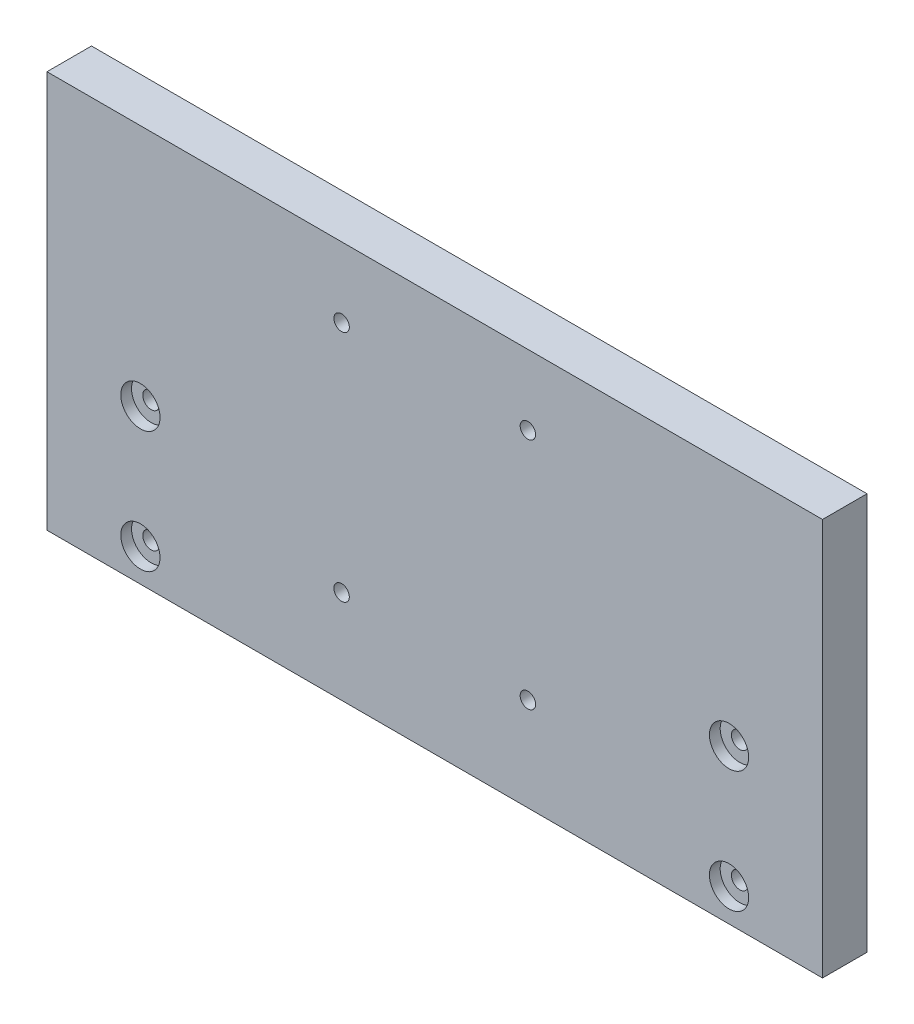
ISO-10303-21;
HEADER;
FILE_DESCRIPTION(('STEP AP214'),'2;1');
FILE_NAME('part.step','',(''),(''),'','','');
FILE_SCHEMA(('AUTOMOTIVE_DESIGN { 1 0 10303 214 1 1 1 1 }'));
ENDSEC;
DATA;
#1=APPLICATION_CONTEXT('core data for automotive mechanical design processes');
#2=APPLICATION_PROTOCOL_DEFINITION('international standard','automotive_design',2000,#1);
#3=PRODUCT_CONTEXT('',#1,'mechanical');
#4=PRODUCT('Part','Part','',(#3));
#5=PRODUCT_RELATED_PRODUCT_CATEGORY('part','',(#4));
#6=PRODUCT_DEFINITION_FORMATION('','',#4);
#7=PRODUCT_DEFINITION_CONTEXT('part definition',#1,'design');
#8=PRODUCT_DEFINITION('design','',#6,#7);
#9=PRODUCT_DEFINITION_SHAPE('','',#8);
#10=(LENGTH_UNIT() NAMED_UNIT(*) SI_UNIT(.MILLI.,.METRE.));
#11=(NAMED_UNIT(*) PLANE_ANGLE_UNIT() SI_UNIT($,.RADIAN.));
#12=(NAMED_UNIT(*) SI_UNIT($,.STERADIAN.) SOLID_ANGLE_UNIT());
#13=UNCERTAINTY_MEASURE_WITH_UNIT(LENGTH_MEASURE(1.E-05),#10,'distance_accuracy_value','');
#14=(GEOMETRIC_REPRESENTATION_CONTEXT(3) GLOBAL_UNCERTAINTY_ASSIGNED_CONTEXT((#13)) GLOBAL_UNIT_ASSIGNED_CONTEXT((#10,
#11,#12)) REPRESENTATION_CONTEXT('',''));
#15=CARTESIAN_POINT('',(0.,0.,0.));
#16=DIRECTION('',(0.,0.,1.));
#17=DIRECTION('',(1.,0.,0.));
#18=AXIS2_PLACEMENT_3D('',#15,#16,#17);
#19=CARTESIAN_POINT('',(83.,0.,9.53));
#20=DIRECTION('',(0.,1.,0.));
#21=DIRECTION('',(-1.,0.,0.));
#22=AXIS2_PLACEMENT_3D('',#19,#20,#21);
#23=PLANE('',#22);
#24=DIRECTION('',(1.,0.,0.));
#25=VECTOR('',#24,1.);
#26=CARTESIAN_POINT('',(83.,0.,0.));
#27=LINE('',#26,#25);
#28=CARTESIAN_POINT('',(0.,0.,0.));
#29=VERTEX_POINT('',#28);
#30=CARTESIAN_POINT('',(166.,0.,0.));
#31=VERTEX_POINT('',#30);
#32=EDGE_CURVE('E105',#29,#31,#27,.T.);
#33=ORIENTED_EDGE('',*,*,#32,.T.);
#34=DIRECTION('',(0.,0.,-1.));
#35=VECTOR('',#34,1.);
#36=CARTESIAN_POINT('',(166.,0.,9.53));
#37=LINE('',#36,#35);
#38=CARTESIAN_POINT('',(166.,0.,9.53));
#39=VERTEX_POINT('',#38);
#40=EDGE_CURVE('E11',#39,#31,#37,.T.);
#41=ORIENTED_EDGE('',*,*,#40,.F.);
#42=DIRECTION('',(1.,0.,0.));
#43=VECTOR('',#42,1.);
#44=CARTESIAN_POINT('',(83.,0.,9.53));
#45=LINE('',#44,#43);
#46=CARTESIAN_POINT('',(0.,0.,9.53));
#47=VERTEX_POINT('',#46);
#48=EDGE_CURVE('E90',#47,#39,#45,.T.);
#49=ORIENTED_EDGE('',*,*,#48,.F.);
#50=DIRECTION('',(0.,0.,-1.));
#51=VECTOR('',#50,1.);
#52=CARTESIAN_POINT('',(0.,0.,9.53));
#53=LINE('',#52,#51);
#54=EDGE_CURVE('E57',#47,#29,#53,.T.);
#55=ORIENTED_EDGE('',*,*,#54,.T.);
#56=EDGE_LOOP('',(#33,#41,#49,#55));
#57=FACE_BOUND('',#56,.T.);
#58=ADVANCED_FACE('F39',(#57),#23,.F.);
#59=CARTESIAN_POINT('',(166.,-102.701770866364,9.53));
#60=DIRECTION('',(-1.,0.,0.));
#61=DIRECTION('',(0.,0.,1.));
#62=AXIS2_PLACEMENT_3D('',#59,#60,#61);
#63=PLANE('',#62);
#64=DIRECTION('',(0.,1.,0.));
#65=VECTOR('',#64,1.);
#66=CARTESIAN_POINT('',(166.,-102.701770866364,0.));
#67=LINE('',#66,#65);
#68=CARTESIAN_POINT('',(166.,85.,0.));
#69=VERTEX_POINT('',#68);
#70=EDGE_CURVE('E95',#31,#69,#67,.T.);
#71=ORIENTED_EDGE('',*,*,#70,.T.);
#72=DIRECTION('',(0.,0.,-1.));
#73=VECTOR('',#72,1.);
#74=CARTESIAN_POINT('',(166.,85.,9.53));
#75=LINE('',#74,#73);
#76=CARTESIAN_POINT('',(166.,85.,9.53));
#77=VERTEX_POINT('',#76);
#78=EDGE_CURVE('E48',#77,#69,#75,.T.);
#79=ORIENTED_EDGE('',*,*,#78,.F.);
#80=DIRECTION('',(0.,1.,0.));
#81=VECTOR('',#80,1.);
#82=CARTESIAN_POINT('',(166.,-102.701770866364,9.53));
#83=LINE('',#82,#81);
#84=EDGE_CURVE('E82',#39,#77,#83,.T.);
#85=ORIENTED_EDGE('',*,*,#84,.F.);
#86=ORIENTED_EDGE('',*,*,#40,.T.);
#87=EDGE_LOOP('',(#71,#79,#85,#86));
#88=FACE_BOUND('',#87,.T.);
#89=ADVANCED_FACE('F94',(#88),#63,.F.);
#90=CARTESIAN_POINT('',(83.,85.,9.53));
#91=DIRECTION('',(0.,1.,0.));
#92=DIRECTION('',(-1.,0.,0.));
#93=AXIS2_PLACEMENT_3D('',#90,#91,#92);
#94=PLANE('',#93);
#95=DIRECTION('',(1.,0.,0.));
#96=VECTOR('',#95,1.);
#97=CARTESIAN_POINT('',(83.,85.,0.));
#98=LINE('',#97,#96);
#99=CARTESIAN_POINT('',(0.,85.,0.));
#100=VERTEX_POINT('',#99);
#101=EDGE_CURVE('E109',#100,#69,#98,.T.);
#102=ORIENTED_EDGE('',*,*,#101,.F.);
#103=DIRECTION('',(0.,0.,-1.));
#104=VECTOR('',#103,1.);
#105=CARTESIAN_POINT('',(0.,85.,9.53));
#106=LINE('',#105,#104);
#107=CARTESIAN_POINT('',(0.,85.,9.53));
#108=VERTEX_POINT('',#107);
#109=EDGE_CURVE('E71',#108,#100,#106,.T.);
#110=ORIENTED_EDGE('',*,*,#109,.F.);
#111=DIRECTION('',(1.,0.,0.));
#112=VECTOR('',#111,1.);
#113=CARTESIAN_POINT('',(83.,85.,9.53));
#114=LINE('',#113,#112);
#115=EDGE_CURVE('E89',#108,#77,#114,.T.);
#116=ORIENTED_EDGE('',*,*,#115,.T.);
#117=ORIENTED_EDGE('',*,*,#78,.T.);
#118=EDGE_LOOP('',(#102,#110,#116,#117));
#119=FACE_BOUND('',#118,.T.);
#120=ADVANCED_FACE('F99',(#119),#94,.T.);
#121=CARTESIAN_POINT('',(0.,-102.701770866364,9.53));
#122=DIRECTION('',(-1.,0.,0.));
#123=DIRECTION('',(0.,-1.,0.));
#124=AXIS2_PLACEMENT_3D('',#121,#122,#123);
#125=PLANE('',#124);
#126=DIRECTION('',(0.,1.,0.));
#127=VECTOR('',#126,1.);
#128=CARTESIAN_POINT('',(0.,-102.701770866364,0.));
#129=LINE('',#128,#127);
#130=EDGE_CURVE('E111',#29,#100,#129,.T.);
#131=ORIENTED_EDGE('',*,*,#130,.F.);
#132=ORIENTED_EDGE('',*,*,#54,.F.);
#133=DIRECTION('',(0.,1.,0.));
#134=VECTOR('',#133,1.);
#135=CARTESIAN_POINT('',(0.,-102.701770866364,9.53));
#136=LINE('',#135,#134);
#137=EDGE_CURVE('E100',#47,#108,#136,.T.);
#138=ORIENTED_EDGE('',*,*,#137,.T.);
#139=ORIENTED_EDGE('',*,*,#109,.T.);
#140=EDGE_LOOP('',(#131,#132,#138,#139));
#141=FACE_BOUND('',#140,.T.);
#142=ADVANCED_FACE('F211',(#141),#125,.T.);
#143=CARTESIAN_POINT('',(83.,-102.701770866364,9.53));
#144=DIRECTION('',(0.,0.,1.));
#145=DIRECTION('',(1.,0.,0.));
#146=AXIS2_PLACEMENT_3D('',#143,#144,#145);
#147=PLANE('',#146);
#148=CARTESIAN_POINT('',(63.065,70.,9.53));
#149=DIRECTION('',(0.,0.,1.));
#150=DIRECTION('',(1.,0.,0.));
#151=AXIS2_PLACEMENT_3D('',#148,#149,#150);
#152=CIRCLE('',#151,1.64999999999998);
#153=CARTESIAN_POINT('',(64.715,70.,9.53));
#154=VERTEX_POINT('',#153);
#155=EDGE_CURVE('E136',#154,#154,#152,.T.);
#156=ORIENTED_EDGE('',*,*,#155,.F.);
#157=EDGE_LOOP('',(#156));
#158=FACE_BOUND('',#157,.T.);
#159=CARTESIAN_POINT('',(63.065,20.,9.53));
#160=DIRECTION('',(0.,0.,1.));
#161=DIRECTION('',(1.,0.,0.));
#162=AXIS2_PLACEMENT_3D('',#159,#160,#161);
#163=CIRCLE('',#162,1.64999999999998);
#164=CARTESIAN_POINT('',(64.715,20.,9.53));
#165=VERTEX_POINT('',#164);
#166=EDGE_CURVE('E126',#165,#165,#163,.T.);
#167=ORIENTED_EDGE('',*,*,#166,.F.);
#168=EDGE_LOOP('',(#167));
#169=FACE_BOUND('',#168,.T.);
#170=CARTESIAN_POINT('',(102.935,70.,9.53));
#171=DIRECTION('',(0.,0.,1.));
#172=DIRECTION('',(1.,0.,0.));
#173=AXIS2_PLACEMENT_3D('',#170,#171,#172);
#174=CIRCLE('',#173,1.64999999999998);
#175=CARTESIAN_POINT('',(104.585,70.,9.53));
#176=VERTEX_POINT('',#175);
#177=EDGE_CURVE('E123',#176,#176,#174,.T.);
#178=ORIENTED_EDGE('',*,*,#177,.F.);
#179=EDGE_LOOP('',(#178));
#180=FACE_BOUND('',#179,.T.);
#181=CARTESIAN_POINT('',(102.935,20.,9.53));
#182=DIRECTION('',(0.,0.,1.));
#183=DIRECTION('',(1.,0.,0.));
#184=AXIS2_PLACEMENT_3D('',#181,#182,#183);
#185=CIRCLE('',#184,1.64999999999998);
#186=CARTESIAN_POINT('',(104.585,20.,9.53));
#187=VERTEX_POINT('',#186);
#188=EDGE_CURVE('E120',#187,#187,#185,.T.);
#189=ORIENTED_EDGE('',*,*,#188,.F.);
#190=EDGE_LOOP('',(#189));
#191=FACE_BOUND('',#190,.T.);
#192=CARTESIAN_POINT('',(20.,33.,9.53));
#193=DIRECTION('',(0.,0.,1.));
#194=DIRECTION('',(1.,0.,0.));
#195=AXIS2_PLACEMENT_3D('',#192,#193,#194);
#196=CIRCLE('',#195,4.2);
#197=CARTESIAN_POINT('',(24.2,33.,9.53));
#198=VERTEX_POINT('',#197);
#199=EDGE_CURVE('E119',#198,#198,#196,.T.);
#200=ORIENTED_EDGE('',*,*,#199,.F.);
#201=EDGE_LOOP('',(#200));
#202=FACE_BOUND('',#201,.T.);
#203=CARTESIAN_POINT('',(20.,7.00000000000001,9.53));
#204=DIRECTION('',(0.,0.,1.));
#205=DIRECTION('',(1.,0.,0.));
#206=AXIS2_PLACEMENT_3D('',#203,#204,#205);
#207=CIRCLE('',#206,4.2);
#208=CARTESIAN_POINT('',(24.2,7.00000000000001,9.53));
#209=VERTEX_POINT('',#208);
#210=EDGE_CURVE('E152',#209,#209,#207,.T.);
#211=ORIENTED_EDGE('',*,*,#210,.F.);
#212=EDGE_LOOP('',(#211));
#213=FACE_BOUND('',#212,.T.);
#214=CARTESIAN_POINT('',(146.,33.,9.53));
#215=DIRECTION('',(0.,0.,1.));
#216=DIRECTION('',(1.,0.,0.));
#217=AXIS2_PLACEMENT_3D('',#214,#215,#216);
#218=CIRCLE('',#217,4.20000000000001);
#219=CARTESIAN_POINT('',(150.2,33.,9.53));
#220=VERTEX_POINT('',#219);
#221=EDGE_CURVE('E164',#220,#220,#218,.T.);
#222=ORIENTED_EDGE('',*,*,#221,.F.);
#223=EDGE_LOOP('',(#222));
#224=FACE_BOUND('',#223,.T.);
#225=CARTESIAN_POINT('',(146.,7.00000000000001,9.53));
#226=DIRECTION('',(0.,0.,1.));
#227=DIRECTION('',(1.,0.,0.));
#228=AXIS2_PLACEMENT_3D('',#225,#226,#227);
#229=CIRCLE('',#228,4.20000000000001);
#230=CARTESIAN_POINT('',(150.2,7.00000000000001,9.53));
#231=VERTEX_POINT('',#230);
#232=EDGE_CURVE('E176',#231,#231,#229,.T.);
#233=ORIENTED_EDGE('',*,*,#232,.F.);
#234=EDGE_LOOP('',(#233));
#235=FACE_BOUND('',#234,.T.);
#236=ORIENTED_EDGE('',*,*,#48,.T.);
#237=ORIENTED_EDGE('',*,*,#84,.T.);
#238=ORIENTED_EDGE('',*,*,#115,.F.);
#239=ORIENTED_EDGE('',*,*,#137,.F.);
#240=EDGE_LOOP('',(#236,#237,#238,#239));
#241=FACE_BOUND('',#240,.T.);
#242=ADVANCED_FACE('F86',(#158,#169,#180,#191,#202,#213,#224,#235,#241),#147,.T.);
#243=CARTESIAN_POINT('',(83.,-102.701770866364,0.));
#244=DIRECTION('',(0.,0.,1.));
#245=DIRECTION('',(1.,0.,0.));
#246=AXIS2_PLACEMENT_3D('',#243,#244,#245);
#247=PLANE('',#246);
#248=CARTESIAN_POINT('',(63.065,70.,0.));
#249=DIRECTION('',(0.,0.,1.));
#250=DIRECTION('',(1.,0.,0.));
#251=AXIS2_PLACEMENT_3D('',#248,#249,#250);
#252=CIRCLE('',#251,1.64999999999998);
#253=CARTESIAN_POINT('',(64.715,70.,0.));
#254=VERTEX_POINT('',#253);
#255=EDGE_CURVE('E42',#254,#254,#252,.T.);
#256=ORIENTED_EDGE('',*,*,#255,.T.);
#257=EDGE_LOOP('',(#256));
#258=FACE_BOUND('',#257,.T.);
#259=CARTESIAN_POINT('',(63.065,20.,0.));
#260=DIRECTION('',(0.,0.,1.));
#261=DIRECTION('',(1.,0.,0.));
#262=AXIS2_PLACEMENT_3D('',#259,#260,#261);
#263=CIRCLE('',#262,1.64999999999998);
#264=CARTESIAN_POINT('',(64.715,20.,0.));
#265=VERTEX_POINT('',#264);
#266=EDGE_CURVE('E124',#265,#265,#263,.T.);
#267=ORIENTED_EDGE('',*,*,#266,.T.);
#268=EDGE_LOOP('',(#267));
#269=FACE_BOUND('',#268,.T.);
#270=CARTESIAN_POINT('',(102.935,70.,0.));
#271=DIRECTION('',(0.,0.,1.));
#272=DIRECTION('',(1.,0.,0.));
#273=AXIS2_PLACEMENT_3D('',#270,#271,#272);
#274=CIRCLE('',#273,1.64999999999998);
#275=CARTESIAN_POINT('',(104.585,70.,0.));
#276=VERTEX_POINT('',#275);
#277=EDGE_CURVE('E121',#276,#276,#274,.T.);
#278=ORIENTED_EDGE('',*,*,#277,.T.);
#279=EDGE_LOOP('',(#278));
#280=FACE_BOUND('',#279,.T.);
#281=CARTESIAN_POINT('',(102.935,20.,0.));
#282=DIRECTION('',(0.,0.,1.));
#283=DIRECTION('',(1.,0.,0.));
#284=AXIS2_PLACEMENT_3D('',#281,#282,#283);
#285=CIRCLE('',#284,1.64999999999998);
#286=CARTESIAN_POINT('',(104.585,20.,0.));
#287=VERTEX_POINT('',#286);
#288=EDGE_CURVE('E116',#287,#287,#285,.T.);
#289=ORIENTED_EDGE('',*,*,#288,.T.);
#290=EDGE_LOOP('',(#289));
#291=FACE_BOUND('',#290,.T.);
#292=CARTESIAN_POINT('',(20.,33.,0.));
#293=DIRECTION('',(0.,0.,1.));
#294=DIRECTION('',(1.,0.,0.));
#295=AXIS2_PLACEMENT_3D('',#292,#293,#294);
#296=CIRCLE('',#295,1.8);
#297=CARTESIAN_POINT('',(21.8,33.,0.));
#298=VERTEX_POINT('',#297);
#299=EDGE_CURVE('E149',#298,#298,#296,.T.);
#300=ORIENTED_EDGE('',*,*,#299,.T.);
#301=EDGE_LOOP('',(#300));
#302=FACE_BOUND('',#301,.T.);
#303=CARTESIAN_POINT('',(20.,7.00000000000001,0.));
#304=DIRECTION('',(0.,0.,1.));
#305=DIRECTION('',(1.,0.,0.));
#306=AXIS2_PLACEMENT_3D('',#303,#304,#305);
#307=CIRCLE('',#306,1.8);
#308=CARTESIAN_POINT('',(21.8,7.00000000000001,0.));
#309=VERTEX_POINT('',#308);
#310=EDGE_CURVE('E161',#309,#309,#307,.T.);
#311=ORIENTED_EDGE('',*,*,#310,.T.);
#312=EDGE_LOOP('',(#311));
#313=FACE_BOUND('',#312,.T.);
#314=CARTESIAN_POINT('',(146.,33.,0.));
#315=DIRECTION('',(0.,0.,1.));
#316=DIRECTION('',(1.,0.,0.));
#317=AXIS2_PLACEMENT_3D('',#314,#315,#316);
#318=CIRCLE('',#317,1.8);
#319=CARTESIAN_POINT('',(147.8,33.,0.));
#320=VERTEX_POINT('',#319);
#321=EDGE_CURVE('E173',#320,#320,#318,.T.);
#322=ORIENTED_EDGE('',*,*,#321,.T.);
#323=EDGE_LOOP('',(#322));
#324=FACE_BOUND('',#323,.T.);
#325=CARTESIAN_POINT('',(146.,7.00000000000001,0.));
#326=DIRECTION('',(0.,0.,1.));
#327=DIRECTION('',(1.,0.,0.));
#328=AXIS2_PLACEMENT_3D('',#325,#326,#327);
#329=CIRCLE('',#328,1.8);
#330=CARTESIAN_POINT('',(147.8,7.00000000000001,0.));
#331=VERTEX_POINT('',#330);
#332=EDGE_CURVE('E107',#331,#331,#329,.T.);
#333=ORIENTED_EDGE('',*,*,#332,.T.);
#334=EDGE_LOOP('',(#333));
#335=FACE_BOUND('',#334,.T.);
#336=ORIENTED_EDGE('',*,*,#32,.F.);
#337=ORIENTED_EDGE('',*,*,#130,.T.);
#338=ORIENTED_EDGE('',*,*,#101,.T.);
#339=ORIENTED_EDGE('',*,*,#70,.F.);
#340=EDGE_LOOP('',(#336,#337,#338,#339));
#341=FACE_BOUND('',#340,.T.);
#342=ADVANCED_FACE('F188',(#258,#269,#280,#291,#302,#313,#324,#335,#341),#247,.F.);
#343=CARTESIAN_POINT('',(146.,7.00000000000001,9.53));
#344=DIRECTION('',(0.,0.,1.));
#345=DIRECTION('',(1.,0.,0.));
#346=AXIS2_PLACEMENT_3D('',#343,#344,#345);
#347=CYLINDRICAL_SURFACE('',#346,1.8);
#348=ORIENTED_EDGE('',*,*,#332,.F.);
#349=EDGE_LOOP('',(#348));
#350=FACE_BOUND('',#349,.T.);
#351=CARTESIAN_POINT('',(146.,7.00000000000001,7.23));
#352=DIRECTION('',(0.,0.,1.));
#353=DIRECTION('',(1.,0.,0.));
#354=AXIS2_PLACEMENT_3D('',#351,#352,#353);
#355=CIRCLE('',#354,1.8);
#356=CARTESIAN_POINT('',(147.8,7.00000000000001,7.23));
#357=VERTEX_POINT('',#356);
#358=EDGE_CURVE('E182',#357,#357,#355,.T.);
#359=ORIENTED_EDGE('',*,*,#358,.T.);
#360=EDGE_LOOP('',(#359));
#361=FACE_BOUND('',#360,.T.);
#362=ADVANCED_FACE('F191',(#350,#361),#347,.F.);
#363=CARTESIAN_POINT('',(147.8,7.00000000000001,7.23));
#364=DIRECTION('',(0.,0.,-1.));
#365=DIRECTION('',(-1.,0.,0.));
#366=AXIS2_PLACEMENT_3D('',#363,#364,#365);
#367=PLANE('',#366);
#368=ORIENTED_EDGE('',*,*,#358,.F.);
#369=EDGE_LOOP('',(#368));
#370=FACE_BOUND('',#369,.T.);
#371=CARTESIAN_POINT('',(146.,7.00000000000001,7.23));
#372=DIRECTION('',(0.,0.,1.));
#373=DIRECTION('',(1.,0.,0.));
#374=AXIS2_PLACEMENT_3D('',#371,#372,#373);
#375=CIRCLE('',#374,4.20000000000001);
#376=CARTESIAN_POINT('',(150.2,7.00000000000001,7.23));
#377=VERTEX_POINT('',#376);
#378=EDGE_CURVE('E179',#377,#377,#375,.T.);
#379=ORIENTED_EDGE('',*,*,#378,.T.);
#380=EDGE_LOOP('',(#379));
#381=FACE_BOUND('',#380,.T.);
#382=ADVANCED_FACE('F194',(#370,#381),#367,.F.);
#383=CARTESIAN_POINT('',(146.,7.00000000000001,9.53));
#384=DIRECTION('',(0.,0.,1.));
#385=DIRECTION('',(1.,0.,0.));
#386=AXIS2_PLACEMENT_3D('',#383,#384,#385);
#387=CYLINDRICAL_SURFACE('',#386,4.20000000000001);
#388=ORIENTED_EDGE('',*,*,#378,.F.);
#389=EDGE_LOOP('',(#388));
#390=FACE_BOUND('',#389,.T.);
#391=ORIENTED_EDGE('',*,*,#232,.T.);
#392=EDGE_LOOP('',(#391));
#393=FACE_BOUND('',#392,.T.);
#394=ADVANCED_FACE('F200',(#390,#393),#387,.F.);
#395=CARTESIAN_POINT('',(146.,33.,9.53));
#396=DIRECTION('',(0.,0.,1.));
#397=DIRECTION('',(1.,0.,0.));
#398=AXIS2_PLACEMENT_3D('',#395,#396,#397);
#399=CYLINDRICAL_SURFACE('',#398,1.8);
#400=ORIENTED_EDGE('',*,*,#321,.F.);
#401=EDGE_LOOP('',(#400));
#402=FACE_BOUND('',#401,.T.);
#403=CARTESIAN_POINT('',(146.,33.,7.23));
#404=DIRECTION('',(0.,0.,1.));
#405=DIRECTION('',(1.,0.,0.));
#406=AXIS2_PLACEMENT_3D('',#403,#404,#405);
#407=CIRCLE('',#406,1.8);
#408=CARTESIAN_POINT('',(147.8,33.,7.23));
#409=VERTEX_POINT('',#408);
#410=EDGE_CURVE('E170',#409,#409,#407,.T.);
#411=ORIENTED_EDGE('',*,*,#410,.T.);
#412=EDGE_LOOP('',(#411));
#413=FACE_BOUND('',#412,.T.);
#414=ADVANCED_FACE('F206',(#402,#413),#399,.F.);
#415=CARTESIAN_POINT('',(147.8,33.,7.23));
#416=DIRECTION('',(0.,0.,-1.));
#417=DIRECTION('',(-1.,0.,0.));
#418=AXIS2_PLACEMENT_3D('',#415,#416,#417);
#419=PLANE('',#418);
#420=ORIENTED_EDGE('',*,*,#410,.F.);
#421=EDGE_LOOP('',(#420));
#422=FACE_BOUND('',#421,.T.);
#423=CARTESIAN_POINT('',(146.,33.,7.23));
#424=DIRECTION('',(0.,0.,1.));
#425=DIRECTION('',(1.,0.,0.));
#426=AXIS2_PLACEMENT_3D('',#423,#424,#425);
#427=CIRCLE('',#426,4.20000000000001);
#428=CARTESIAN_POINT('',(150.2,33.,7.23));
#429=VERTEX_POINT('',#428);
#430=EDGE_CURVE('E167',#429,#429,#427,.T.);
#431=ORIENTED_EDGE('',*,*,#430,.T.);
#432=EDGE_LOOP('',(#431));
#433=FACE_BOUND('',#432,.T.);
#434=ADVANCED_FACE('F267',(#422,#433),#419,.F.);
#435=CARTESIAN_POINT('',(146.,33.,9.53));
#436=DIRECTION('',(0.,0.,1.));
#437=DIRECTION('',(1.,0.,0.));
#438=AXIS2_PLACEMENT_3D('',#435,#436,#437);
#439=CYLINDRICAL_SURFACE('',#438,4.20000000000001);
#440=ORIENTED_EDGE('',*,*,#430,.F.);
#441=EDGE_LOOP('',(#440));
#442=FACE_BOUND('',#441,.T.);
#443=ORIENTED_EDGE('',*,*,#221,.T.);
#444=EDGE_LOOP('',(#443));
#445=FACE_BOUND('',#444,.T.);
#446=ADVANCED_FACE('F277',(#442,#445),#439,.F.);
#447=CARTESIAN_POINT('',(20.,7.00000000000001,9.53));
#448=DIRECTION('',(0.,0.,1.));
#449=DIRECTION('',(1.,0.,0.));
#450=AXIS2_PLACEMENT_3D('',#447,#448,#449);
#451=CYLINDRICAL_SURFACE('',#450,1.8);
#452=ORIENTED_EDGE('',*,*,#310,.F.);
#453=EDGE_LOOP('',(#452));
#454=FACE_BOUND('',#453,.T.);
#455=CARTESIAN_POINT('',(20.,7.00000000000001,7.23));
#456=DIRECTION('',(0.,0.,1.));
#457=DIRECTION('',(1.,0.,0.));
#458=AXIS2_PLACEMENT_3D('',#455,#456,#457);
#459=CIRCLE('',#458,1.8);
#460=CARTESIAN_POINT('',(21.8,7.00000000000001,7.23));
#461=VERTEX_POINT('',#460);
#462=EDGE_CURVE('E158',#461,#461,#459,.T.);
#463=ORIENTED_EDGE('',*,*,#462,.T.);
#464=EDGE_LOOP('',(#463));
#465=FACE_BOUND('',#464,.T.);
#466=ADVANCED_FACE('F287',(#454,#465),#451,.F.);
#467=CARTESIAN_POINT('',(21.8,7.00000000000001,7.23));
#468=DIRECTION('',(0.,0.,-1.));
#469=DIRECTION('',(-1.,0.,0.));
#470=AXIS2_PLACEMENT_3D('',#467,#468,#469);
#471=PLANE('',#470);
#472=ORIENTED_EDGE('',*,*,#462,.F.);
#473=EDGE_LOOP('',(#472));
#474=FACE_BOUND('',#473,.T.);
#475=CARTESIAN_POINT('',(20.,7.00000000000001,7.23));
#476=DIRECTION('',(0.,0.,1.));
#477=DIRECTION('',(1.,0.,0.));
#478=AXIS2_PLACEMENT_3D('',#475,#476,#477);
#479=CIRCLE('',#478,4.2);
#480=CARTESIAN_POINT('',(24.2,7.00000000000001,7.23));
#481=VERTEX_POINT('',#480);
#482=EDGE_CURVE('E155',#481,#481,#479,.T.);
#483=ORIENTED_EDGE('',*,*,#482,.T.);
#484=EDGE_LOOP('',(#483));
#485=FACE_BOUND('',#484,.T.);
#486=ADVANCED_FACE('F297',(#474,#485),#471,.F.);
#487=CARTESIAN_POINT('',(20.,7.00000000000001,9.53));
#488=DIRECTION('',(0.,0.,1.));
#489=DIRECTION('',(1.,0.,0.));
#490=AXIS2_PLACEMENT_3D('',#487,#488,#489);
#491=CYLINDRICAL_SURFACE('',#490,4.2);
#492=ORIENTED_EDGE('',*,*,#482,.F.);
#493=EDGE_LOOP('',(#492));
#494=FACE_BOUND('',#493,.T.);
#495=ORIENTED_EDGE('',*,*,#210,.T.);
#496=EDGE_LOOP('',(#495));
#497=FACE_BOUND('',#496,.T.);
#498=ADVANCED_FACE('F307',(#494,#497),#491,.F.);
#499=CARTESIAN_POINT('',(20.,33.,9.53));
#500=DIRECTION('',(0.,0.,1.));
#501=DIRECTION('',(1.,0.,0.));
#502=AXIS2_PLACEMENT_3D('',#499,#500,#501);
#503=CYLINDRICAL_SURFACE('',#502,1.8);
#504=ORIENTED_EDGE('',*,*,#299,.F.);
#505=EDGE_LOOP('',(#504));
#506=FACE_BOUND('',#505,.T.);
#507=CARTESIAN_POINT('',(20.,33.,7.23));
#508=DIRECTION('',(0.,0.,1.));
#509=DIRECTION('',(1.,0.,0.));
#510=AXIS2_PLACEMENT_3D('',#507,#508,#509);
#511=CIRCLE('',#510,1.8);
#512=CARTESIAN_POINT('',(21.8,33.,7.23));
#513=VERTEX_POINT('',#512);
#514=EDGE_CURVE('E146',#513,#513,#511,.T.);
#515=ORIENTED_EDGE('',*,*,#514,.T.);
#516=EDGE_LOOP('',(#515));
#517=FACE_BOUND('',#516,.T.);
#518=ADVANCED_FACE('F317',(#506,#517),#503,.F.);
#519=CARTESIAN_POINT('',(21.8,33.,7.23));
#520=DIRECTION('',(0.,0.,-1.));
#521=DIRECTION('',(-1.,0.,0.));
#522=AXIS2_PLACEMENT_3D('',#519,#520,#521);
#523=PLANE('',#522);
#524=ORIENTED_EDGE('',*,*,#514,.F.);
#525=EDGE_LOOP('',(#524));
#526=FACE_BOUND('',#525,.T.);
#527=CARTESIAN_POINT('',(20.,33.,7.23));
#528=DIRECTION('',(0.,0.,1.));
#529=DIRECTION('',(1.,0.,0.));
#530=AXIS2_PLACEMENT_3D('',#527,#528,#529);
#531=CIRCLE('',#530,4.2);
#532=CARTESIAN_POINT('',(24.2,33.,7.23));
#533=VERTEX_POINT('',#532);
#534=EDGE_CURVE('E143',#533,#533,#531,.T.);
#535=ORIENTED_EDGE('',*,*,#534,.T.);
#536=EDGE_LOOP('',(#535));
#537=FACE_BOUND('',#536,.T.);
#538=ADVANCED_FACE('F327',(#526,#537),#523,.F.);
#539=CARTESIAN_POINT('',(20.,33.,9.53));
#540=DIRECTION('',(0.,0.,1.));
#541=DIRECTION('',(1.,0.,0.));
#542=AXIS2_PLACEMENT_3D('',#539,#540,#541);
#543=CYLINDRICAL_SURFACE('',#542,4.2);
#544=ORIENTED_EDGE('',*,*,#534,.F.);
#545=EDGE_LOOP('',(#544));
#546=FACE_BOUND('',#545,.T.);
#547=ORIENTED_EDGE('',*,*,#199,.T.);
#548=EDGE_LOOP('',(#547));
#549=FACE_BOUND('',#548,.T.);
#550=ADVANCED_FACE('F337',(#546,#549),#543,.F.);
#551=CARTESIAN_POINT('',(102.935,20.,9.53));
#552=DIRECTION('',(0.,0.,1.));
#553=DIRECTION('',(1.,0.,0.));
#554=AXIS2_PLACEMENT_3D('',#551,#552,#553);
#555=CYLINDRICAL_SURFACE('',#554,1.64999999999998);
#556=ORIENTED_EDGE('',*,*,#188,.T.);
#557=EDGE_LOOP('',(#556));
#558=FACE_BOUND('',#557,.T.);
#559=ORIENTED_EDGE('',*,*,#288,.F.);
#560=EDGE_LOOP('',(#559));
#561=FACE_BOUND('',#560,.T.);
#562=ADVANCED_FACE('F346',(#558,#561),#555,.F.);
#563=CARTESIAN_POINT('',(102.935,70.,9.53));
#564=DIRECTION('',(0.,0.,1.));
#565=DIRECTION('',(1.,0.,0.));
#566=AXIS2_PLACEMENT_3D('',#563,#564,#565);
#567=CYLINDRICAL_SURFACE('',#566,1.64999999999998);
#568=ORIENTED_EDGE('',*,*,#177,.T.);
#569=EDGE_LOOP('',(#568));
#570=FACE_BOUND('',#569,.T.);
#571=ORIENTED_EDGE('',*,*,#277,.F.);
#572=EDGE_LOOP('',(#571));
#573=FACE_BOUND('',#572,.T.);
#574=ADVANCED_FACE('F370',(#570,#573),#567,.F.);
#575=CARTESIAN_POINT('',(63.065,20.,9.53));
#576=DIRECTION('',(0.,0.,1.));
#577=DIRECTION('',(1.,0.,0.));
#578=AXIS2_PLACEMENT_3D('',#575,#576,#577);
#579=CYLINDRICAL_SURFACE('',#578,1.64999999999998);
#580=ORIENTED_EDGE('',*,*,#166,.T.);
#581=EDGE_LOOP('',(#580));
#582=FACE_BOUND('',#581,.T.);
#583=ORIENTED_EDGE('',*,*,#266,.F.);
#584=EDGE_LOOP('',(#583));
#585=FACE_BOUND('',#584,.T.);
#586=ADVANCED_FACE('F382',(#582,#585),#579,.F.);
#587=CARTESIAN_POINT('',(63.065,70.,9.53));
#588=DIRECTION('',(0.,0.,1.));
#589=DIRECTION('',(1.,0.,0.));
#590=AXIS2_PLACEMENT_3D('',#587,#588,#589);
#591=CYLINDRICAL_SURFACE('',#590,1.64999999999998);
#592=ORIENTED_EDGE('',*,*,#155,.T.);
#593=EDGE_LOOP('',(#592));
#594=FACE_BOUND('',#593,.T.);
#595=ORIENTED_EDGE('',*,*,#255,.F.);
#596=EDGE_LOOP('',(#595));
#597=FACE_BOUND('',#596,.T.);
#598=ADVANCED_FACE('F394',(#594,#597),#591,.F.);
#599=CLOSED_SHELL('',(#58,#89,#120,#142,#242,#342,#362,#382,#394,#414,#434,#446,#466,#486,#498,
#518,#538,#550,#562,#574,#586,#598));
#600=MANIFOLD_SOLID_BREP('B2',#599);
#601=ADVANCED_BREP_SHAPE_REPRESENTATION('',(#18,#600),#14);
#602=SHAPE_DEFINITION_REPRESENTATION(#9,#601);
ENDSEC;
END-ISO-10303-21;
